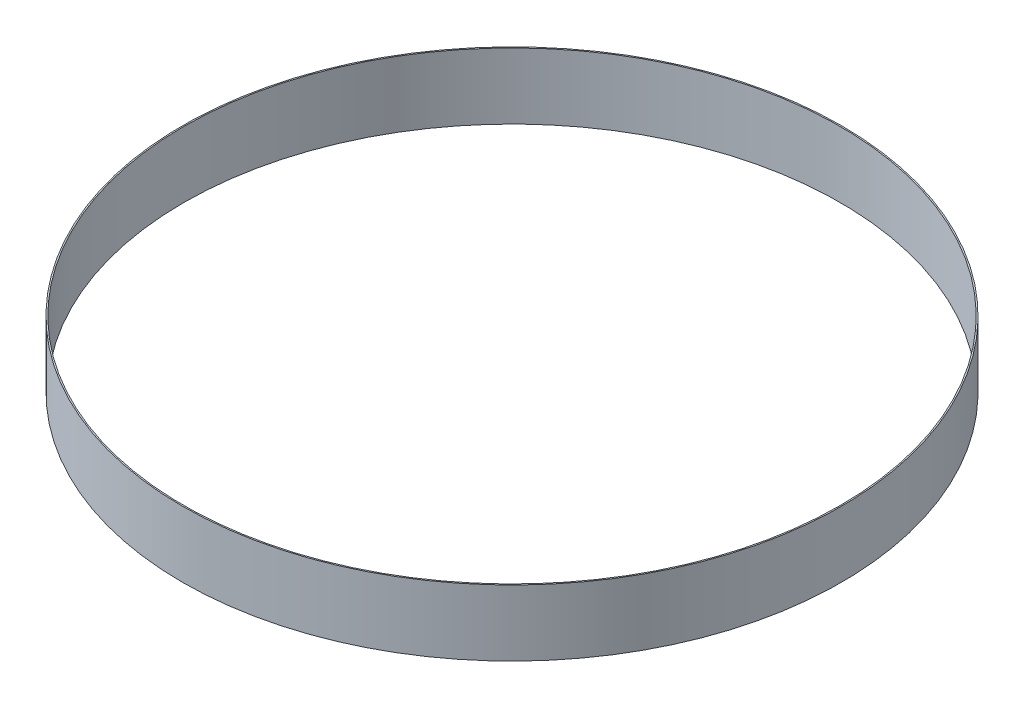
ISO-10303-21;
HEADER;
FILE_DESCRIPTION(('STEP AP214'),'2;1');
FILE_NAME('part.step','',(''),(''),'','','');
FILE_SCHEMA(('AUTOMOTIVE_DESIGN { 1 0 10303 214 1 1 1 1 }'));
ENDSEC;
DATA;
#1=APPLICATION_CONTEXT('core data for automotive mechanical design processes');
#2=APPLICATION_PROTOCOL_DEFINITION('international standard','automotive_design',2000,#1);
#3=PRODUCT_CONTEXT('',#1,'mechanical');
#4=PRODUCT('Part','Part','',(#3));
#5=PRODUCT_RELATED_PRODUCT_CATEGORY('part','',(#4));
#6=PRODUCT_DEFINITION_FORMATION('','',#4);
#7=PRODUCT_DEFINITION_CONTEXT('part definition',#1,'design');
#8=PRODUCT_DEFINITION('design','',#6,#7);
#9=PRODUCT_DEFINITION_SHAPE('','',#8);
#10=(LENGTH_UNIT() NAMED_UNIT(*) SI_UNIT(.MILLI.,.METRE.));
#11=(NAMED_UNIT(*) PLANE_ANGLE_UNIT() SI_UNIT($,.RADIAN.));
#12=(NAMED_UNIT(*) SI_UNIT($,.STERADIAN.) SOLID_ANGLE_UNIT());
#13=UNCERTAINTY_MEASURE_WITH_UNIT(LENGTH_MEASURE(1.E-05),#10,'distance_accuracy_value','');
#14=(GEOMETRIC_REPRESENTATION_CONTEXT(3) GLOBAL_UNCERTAINTY_ASSIGNED_CONTEXT((#13)) GLOBAL_UNIT_ASSIGNED_CONTEXT((#10,
#11,#12)) REPRESENTATION_CONTEXT('',''));
#15=CARTESIAN_POINT('',(0.,0.,0.));
#16=DIRECTION('',(0.,0.,1.));
#17=DIRECTION('',(1.,0.,0.));
#18=AXIS2_PLACEMENT_3D('',#15,#16,#17);
#19=CARTESIAN_POINT('',(0.,50.,0.));
#20=DIRECTION('',(0.,1.,0.));
#21=DIRECTION('',(0.,0.,1.));
#22=AXIS2_PLACEMENT_3D('',#19,#20,#21);
#23=PLANE('',#22);
#24=CARTESIAN_POINT('',(0.,50.,0.));
#25=DIRECTION('',(0.,1.,0.));
#26=DIRECTION('',(0.,0.,1.));
#27=AXIS2_PLACEMENT_3D('',#24,#25,#26);
#28=CIRCLE('',#27,250.);
#29=CARTESIAN_POINT('',(0.,50.,250.));
#30=VERTEX_POINT('',#29);
#31=EDGE_CURVE('E11',#30,#30,#28,.T.);
#32=ORIENTED_EDGE('',*,*,#31,.T.);
#33=EDGE_LOOP('',(#32));
#34=FACE_BOUND('',#33,.T.);
#35=CARTESIAN_POINT('',(0.,50.,0.));
#36=DIRECTION('',(0.,1.,0.));
#37=DIRECTION('',(1.,0.,0.));
#38=AXIS2_PLACEMENT_3D('',#35,#36,#37);
#39=CIRCLE('',#38,249.);
#40=CARTESIAN_POINT('',(249.,50.,0.));
#41=VERTEX_POINT('',#40);
#42=EDGE_CURVE('E48',#41,#41,#39,.T.);
#43=ORIENTED_EDGE('',*,*,#42,.F.);
#44=EDGE_LOOP('',(#43));
#45=FACE_BOUND('',#44,.T.);
#46=ADVANCED_FACE('F37',(#34,#45),#23,.T.);
#47=CARTESIAN_POINT('',(0.,0.,0.));
#48=DIRECTION('',(0.,1.,0.));
#49=DIRECTION('',(0.,0.,1.));
#50=AXIS2_PLACEMENT_3D('',#47,#48,#49);
#51=PLANE('',#50);
#52=CARTESIAN_POINT('',(0.,0.,0.));
#53=DIRECTION('',(0.,1.,0.));
#54=DIRECTION('',(0.,0.,1.));
#55=AXIS2_PLACEMENT_3D('',#52,#53,#54);
#56=CIRCLE('',#55,250.);
#57=CARTESIAN_POINT('',(0.,0.,250.));
#58=VERTEX_POINT('',#57);
#59=EDGE_CURVE('E41',#58,#58,#56,.T.);
#60=ORIENTED_EDGE('',*,*,#59,.F.);
#61=EDGE_LOOP('',(#60));
#62=FACE_BOUND('',#61,.T.);
#63=CARTESIAN_POINT('',(0.,0.,0.));
#64=DIRECTION('',(0.,1.,0.));
#65=DIRECTION('',(1.,0.,0.));
#66=AXIS2_PLACEMENT_3D('',#63,#64,#65);
#67=CIRCLE('',#66,249.);
#68=CARTESIAN_POINT('',(249.,0.,0.));
#69=VERTEX_POINT('',#68);
#70=EDGE_CURVE('E50',#69,#69,#67,.T.);
#71=ORIENTED_EDGE('',*,*,#70,.T.);
#72=EDGE_LOOP('',(#71));
#73=FACE_BOUND('',#72,.T.);
#74=ADVANCED_FACE('F60',(#62,#73),#51,.F.);
#75=CARTESIAN_POINT('',(0.,50.,0.));
#76=DIRECTION('',(0.,-1.,0.));
#77=DIRECTION('',(0.,0.,-1.));
#78=AXIS2_PLACEMENT_3D('',#75,#76,#77);
#79=CYLINDRICAL_SURFACE('',#78,250.);
#80=ORIENTED_EDGE('',*,*,#31,.F.);
#81=EDGE_LOOP('',(#80));
#82=FACE_BOUND('',#81,.T.);
#83=ORIENTED_EDGE('',*,*,#59,.T.);
#84=EDGE_LOOP('',(#83));
#85=FACE_BOUND('',#84,.T.);
#86=ADVANCED_FACE('F39',(#82,#85),#79,.T.);
#87=CARTESIAN_POINT('',(0.,50.,0.));
#88=DIRECTION('',(0.,-1.,0.));
#89=DIRECTION('',(0.,0.,-1.));
#90=AXIS2_PLACEMENT_3D('',#87,#88,#89);
#91=CYLINDRICAL_SURFACE('',#90,249.);
#92=ORIENTED_EDGE('',*,*,#42,.T.);
#93=EDGE_LOOP('',(#92));
#94=FACE_BOUND('',#93,.T.);
#95=ORIENTED_EDGE('',*,*,#70,.F.);
#96=EDGE_LOOP('',(#95));
#97=FACE_BOUND('',#96,.T.);
#98=ADVANCED_FACE('F56',(#94,#97),#91,.F.);
#99=CLOSED_SHELL('',(#46,#74,#86,#98));
#100=MANIFOLD_SOLID_BREP('B2',#99);
#101=ADVANCED_BREP_SHAPE_REPRESENTATION('',(#18,#100),#14);
#102=SHAPE_DEFINITION_REPRESENTATION(#9,#101);
ENDSEC;
END-ISO-10303-21;
